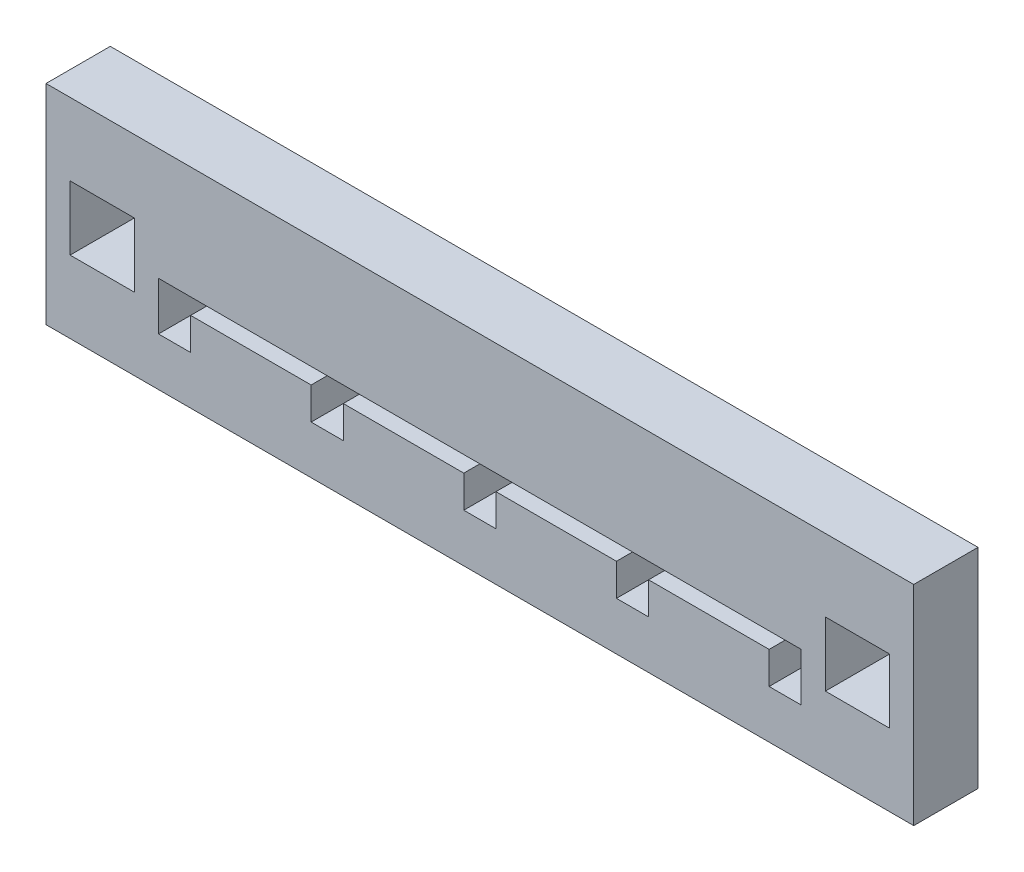
ISO-10303-21;
HEADER;
FILE_DESCRIPTION(('STEP AP214'),'2;1');
FILE_NAME('part.step','',(''),(''),'','','');
FILE_SCHEMA(('AUTOMOTIVE_DESIGN { 1 0 10303 214 1 1 1 1 }'));
ENDSEC;
DATA;
#1=APPLICATION_CONTEXT('core data for automotive mechanical design processes');
#2=APPLICATION_PROTOCOL_DEFINITION('international standard','automotive_design',2000,#1);
#3=PRODUCT_CONTEXT('',#1,'mechanical');
#4=PRODUCT('Part','Part','',(#3));
#5=PRODUCT_RELATED_PRODUCT_CATEGORY('part','',(#4));
#6=PRODUCT_DEFINITION_FORMATION('','',#4);
#7=PRODUCT_DEFINITION_CONTEXT('part definition',#1,'design');
#8=PRODUCT_DEFINITION('design','',#6,#7);
#9=PRODUCT_DEFINITION_SHAPE('','',#8);
#10=(LENGTH_UNIT() NAMED_UNIT(*) SI_UNIT(.MILLI.,.METRE.));
#11=(NAMED_UNIT(*) PLANE_ANGLE_UNIT() SI_UNIT($,.RADIAN.));
#12=(NAMED_UNIT(*) SI_UNIT($,.STERADIAN.) SOLID_ANGLE_UNIT());
#13=UNCERTAINTY_MEASURE_WITH_UNIT(LENGTH_MEASURE(1.E-05),#10,'distance_accuracy_value','');
#14=(GEOMETRIC_REPRESENTATION_CONTEXT(3) GLOBAL_UNCERTAINTY_ASSIGNED_CONTEXT((#13)) GLOBAL_UNIT_ASSIGNED_CONTEXT((#10,
#11,#12)) REPRESENTATION_CONTEXT('',''));
#15=CARTESIAN_POINT('',(0.,0.,0.));
#16=DIRECTION('',(0.,0.,1.));
#17=DIRECTION('',(1.,0.,0.));
#18=AXIS2_PLACEMENT_3D('',#15,#16,#17);
#19=CARTESIAN_POINT('',(0.,0.,4.));
#20=DIRECTION('',(0.,0.,-1.));
#21=DIRECTION('',(-1.,0.,0.));
#22=AXIS2_PLACEMENT_3D('',#19,#20,#21);
#23=PLANE('',#22);
#24=DIRECTION('',(0.,-1.,0.));
#25=VECTOR('',#24,1.);
#26=CARTESIAN_POINT('',(1.5,8.5,4.));
#27=LINE('',#26,#25);
#28=CARTESIAN_POINT('',(1.5,8.5,4.));
#29=VERTEX_POINT('',#28);
#30=CARTESIAN_POINT('',(1.5,4.5,4.));
#31=VERTEX_POINT('',#30);
#32=EDGE_CURVE('E297',#29,#31,#27,.T.);
#33=ORIENTED_EDGE('',*,*,#32,.F.);
#34=DIRECTION('',(-1.,0.,0.));
#35=VECTOR('',#34,1.);
#36=CARTESIAN_POINT('',(1.5,8.5,4.));
#37=LINE('',#36,#35);
#38=CARTESIAN_POINT('',(5.5,8.5,4.));
#39=VERTEX_POINT('',#38);
#40=EDGE_CURVE('E308',#39,#29,#37,.T.);
#41=ORIENTED_EDGE('',*,*,#40,.F.);
#42=DIRECTION('',(0.,1.,0.));
#43=VECTOR('',#42,1.);
#44=CARTESIAN_POINT('',(5.5,8.5,4.));
#45=LINE('',#44,#43);
#46=CARTESIAN_POINT('',(5.5,4.5,4.));
#47=VERTEX_POINT('',#46);
#48=EDGE_CURVE('E304',#47,#39,#45,.T.);
#49=ORIENTED_EDGE('',*,*,#48,.F.);
#50=DIRECTION('',(1.,0.,0.));
#51=VECTOR('',#50,1.);
#52=CARTESIAN_POINT('',(1.5,4.5,4.));
#53=LINE('',#52,#51);
#54=EDGE_CURVE('E300',#31,#47,#53,.T.);
#55=ORIENTED_EDGE('',*,*,#54,.F.);
#56=EDGE_LOOP('',(#33,#41,#49,#55));
#57=FACE_BOUND('',#56,.T.);
#58=DIRECTION('',(0.,-1.,0.));
#59=VECTOR('',#58,1.);
#60=CARTESIAN_POINT('',(0.,0.,4.));
#61=LINE('',#60,#59);
#62=CARTESIAN_POINT('',(0.,13.,4.));
#63=VERTEX_POINT('',#62);
#64=CARTESIAN_POINT('',(0.,0.,4.));
#65=VERTEX_POINT('',#64);
#66=EDGE_CURVE('E543',#63,#65,#61,.T.);
#67=ORIENTED_EDGE('',*,*,#66,.T.);
#68=DIRECTION('',(1.,0.,0.));
#69=VECTOR('',#68,1.);
#70=CARTESIAN_POINT('',(0.,0.,4.));
#71=LINE('',#70,#69);
#72=CARTESIAN_POINT('',(54.,0.,4.));
#73=VERTEX_POINT('',#72);
#74=EDGE_CURVE('E547',#65,#73,#71,.T.);
#75=ORIENTED_EDGE('',*,*,#74,.T.);
#76=DIRECTION('',(0.,1.,0.));
#77=VECTOR('',#76,1.);
#78=CARTESIAN_POINT('',(54.,0.,4.));
#79=LINE('',#78,#77);
#80=CARTESIAN_POINT('',(54.,13.,4.));
#81=VERTEX_POINT('',#80);
#82=EDGE_CURVE('E551',#73,#81,#79,.T.);
#83=ORIENTED_EDGE('',*,*,#82,.T.);
#84=DIRECTION('',(-1.,0.,0.));
#85=VECTOR('',#84,1.);
#86=CARTESIAN_POINT('',(0.,13.,4.));
#87=LINE('',#86,#85);
#88=EDGE_CURVE('E554',#81,#63,#87,.T.);
#89=ORIENTED_EDGE('',*,*,#88,.T.);
#90=EDGE_LOOP('',(#67,#75,#83,#89));
#91=FACE_BOUND('',#90,.T.);
#92=DIRECTION('',(1.,0.,0.));
#93=VECTOR('',#92,1.);
#94=CARTESIAN_POINT('',(7.,3.,4.));
#95=LINE('',#94,#93);
#96=CARTESIAN_POINT('',(7.,3.,4.));
#97=VERTEX_POINT('',#96);
#98=CARTESIAN_POINT('',(9.,3.,4.));
#99=VERTEX_POINT('',#98);
#100=EDGE_CURVE('E340',#97,#99,#95,.T.);
#101=ORIENTED_EDGE('',*,*,#100,.F.);
#102=DIRECTION('',(0.,-1.,0.));
#103=VECTOR('',#102,1.);
#104=CARTESIAN_POINT('',(7.,3.,4.));
#105=LINE('',#104,#103);
#106=CARTESIAN_POINT('',(7.,6.,4.));
#107=VERTEX_POINT('',#106);
#108=EDGE_CURVE('E399',#107,#97,#105,.T.);
#109=ORIENTED_EDGE('',*,*,#108,.F.);
#110=DIRECTION('',(-1.,0.,0.));
#111=VECTOR('',#110,1.);
#112=CARTESIAN_POINT('',(7.,6.,4.));
#113=LINE('',#112,#111);
#114=CARTESIAN_POINT('',(47.,6.,4.));
#115=VERTEX_POINT('',#114);
#116=EDGE_CURVE('E395',#115,#107,#113,.T.);
#117=ORIENTED_EDGE('',*,*,#116,.F.);
#118=DIRECTION('',(0.,1.,0.));
#119=VECTOR('',#118,1.);
#120=CARTESIAN_POINT('',(47.,3.,4.));
#121=LINE('',#120,#119);
#122=CARTESIAN_POINT('',(47.,3.,4.));
#123=VERTEX_POINT('',#122);
#124=EDGE_CURVE('E392',#123,#115,#121,.T.);
#125=ORIENTED_EDGE('',*,*,#124,.F.);
#126=DIRECTION('',(1.,0.,0.));
#127=VECTOR('',#126,1.);
#128=CARTESIAN_POINT('',(45.,3.,4.));
#129=LINE('',#128,#127);
#130=CARTESIAN_POINT('',(45.,3.,4.));
#131=VERTEX_POINT('',#130);
#132=EDGE_CURVE('E389',#131,#123,#129,.T.);
#133=ORIENTED_EDGE('',*,*,#132,.F.);
#134=DIRECTION('',(0.,-1.,0.));
#135=VECTOR('',#134,1.);
#136=CARTESIAN_POINT('',(45.,3.,4.));
#137=LINE('',#136,#135);
#138=CARTESIAN_POINT('',(45.,5.,4.));
#139=VERTEX_POINT('',#138);
#140=EDGE_CURVE('E386',#139,#131,#137,.T.);
#141=ORIENTED_EDGE('',*,*,#140,.F.);
#142=DIRECTION('',(1.,0.,0.));
#143=VECTOR('',#142,1.);
#144=CARTESIAN_POINT('',(37.5,5.,4.));
#145=LINE('',#144,#143);
#146=CARTESIAN_POINT('',(37.5,5.,4.));
#147=VERTEX_POINT('',#146);
#148=EDGE_CURVE('E383',#147,#139,#145,.T.);
#149=ORIENTED_EDGE('',*,*,#148,.F.);
#150=DIRECTION('',(0.,1.,0.));
#151=VECTOR('',#150,1.);
#152=CARTESIAN_POINT('',(37.5,3.,4.));
#153=LINE('',#152,#151);
#154=CARTESIAN_POINT('',(37.5,3.,4.));
#155=VERTEX_POINT('',#154);
#156=EDGE_CURVE('E380',#155,#147,#153,.T.);
#157=ORIENTED_EDGE('',*,*,#156,.F.);
#158=DIRECTION('',(1.,0.,0.));
#159=VECTOR('',#158,1.);
#160=CARTESIAN_POINT('',(35.5,3.,4.));
#161=LINE('',#160,#159);
#162=CARTESIAN_POINT('',(35.5,3.,4.));
#163=VERTEX_POINT('',#162);
#164=EDGE_CURVE('E377',#163,#155,#161,.T.);
#165=ORIENTED_EDGE('',*,*,#164,.F.);
#166=DIRECTION('',(0.,-1.,0.));
#167=VECTOR('',#166,1.);
#168=CARTESIAN_POINT('',(35.5,3.,4.));
#169=LINE('',#168,#167);
#170=CARTESIAN_POINT('',(35.5,5.,4.));
#171=VERTEX_POINT('',#170);
#172=EDGE_CURVE('E374',#171,#163,#169,.T.);
#173=ORIENTED_EDGE('',*,*,#172,.F.);
#174=DIRECTION('',(1.,0.,0.));
#175=VECTOR('',#174,1.);
#176=CARTESIAN_POINT('',(28.,5.,4.));
#177=LINE('',#176,#175);
#178=CARTESIAN_POINT('',(28.,5.,4.));
#179=VERTEX_POINT('',#178);
#180=EDGE_CURVE('E371',#179,#171,#177,.T.);
#181=ORIENTED_EDGE('',*,*,#180,.F.);
#182=DIRECTION('',(0.,1.,0.));
#183=VECTOR('',#182,1.);
#184=CARTESIAN_POINT('',(28.,3.,4.));
#185=LINE('',#184,#183);
#186=CARTESIAN_POINT('',(28.,3.,4.));
#187=VERTEX_POINT('',#186);
#188=EDGE_CURVE('E368',#187,#179,#185,.T.);
#189=ORIENTED_EDGE('',*,*,#188,.F.);
#190=DIRECTION('',(1.,0.,0.));
#191=VECTOR('',#190,1.);
#192=CARTESIAN_POINT('',(26.,3.,4.));
#193=LINE('',#192,#191);
#194=CARTESIAN_POINT('',(26.,3.,4.));
#195=VERTEX_POINT('',#194);
#196=EDGE_CURVE('E365',#195,#187,#193,.T.);
#197=ORIENTED_EDGE('',*,*,#196,.F.);
#198=DIRECTION('',(0.,-1.,0.));
#199=VECTOR('',#198,1.);
#200=CARTESIAN_POINT('',(26.,3.,4.));
#201=LINE('',#200,#199);
#202=CARTESIAN_POINT('',(26.,5.,4.));
#203=VERTEX_POINT('',#202);
#204=EDGE_CURVE('E362',#203,#195,#201,.T.);
#205=ORIENTED_EDGE('',*,*,#204,.F.);
#206=DIRECTION('',(1.,0.,0.));
#207=VECTOR('',#206,1.);
#208=CARTESIAN_POINT('',(18.5,5.,4.));
#209=LINE('',#208,#207);
#210=CARTESIAN_POINT('',(18.5,5.,4.));
#211=VERTEX_POINT('',#210);
#212=EDGE_CURVE('E359',#211,#203,#209,.T.);
#213=ORIENTED_EDGE('',*,*,#212,.F.);
#214=DIRECTION('',(0.,1.,0.));
#215=VECTOR('',#214,1.);
#216=CARTESIAN_POINT('',(18.5,3.,4.));
#217=LINE('',#216,#215);
#218=CARTESIAN_POINT('',(18.5,3.,4.));
#219=VERTEX_POINT('',#218);
#220=EDGE_CURVE('E356',#219,#211,#217,.T.);
#221=ORIENTED_EDGE('',*,*,#220,.F.);
#222=DIRECTION('',(1.,0.,0.));
#223=VECTOR('',#222,1.);
#224=CARTESIAN_POINT('',(16.5,3.,4.));
#225=LINE('',#224,#223);
#226=CARTESIAN_POINT('',(16.5,3.,4.));
#227=VERTEX_POINT('',#226);
#228=EDGE_CURVE('E353',#227,#219,#225,.T.);
#229=ORIENTED_EDGE('',*,*,#228,.F.);
#230=DIRECTION('',(0.,-1.,0.));
#231=VECTOR('',#230,1.);
#232=CARTESIAN_POINT('',(16.5,3.,4.));
#233=LINE('',#232,#231);
#234=CARTESIAN_POINT('',(16.5,5.,4.));
#235=VERTEX_POINT('',#234);
#236=EDGE_CURVE('E350',#235,#227,#233,.T.);
#237=ORIENTED_EDGE('',*,*,#236,.F.);
#238=DIRECTION('',(1.,0.,0.));
#239=VECTOR('',#238,1.);
#240=CARTESIAN_POINT('',(9.,5.,4.));
#241=LINE('',#240,#239);
#242=CARTESIAN_POINT('',(9.,5.,4.));
#243=VERTEX_POINT('',#242);
#244=EDGE_CURVE('E347',#243,#235,#241,.T.);
#245=ORIENTED_EDGE('',*,*,#244,.F.);
#246=DIRECTION('',(0.,1.,0.));
#247=VECTOR('',#246,1.);
#248=CARTESIAN_POINT('',(9.,3.,4.));
#249=LINE('',#248,#247);
#250=EDGE_CURVE('E343',#99,#243,#249,.T.);
#251=ORIENTED_EDGE('',*,*,#250,.F.);
#252=EDGE_LOOP('',(#101,#109,#117,#125,#133,#141,#149,#157,#165,#173,#181,#189,#197,#205,#213,
#221,#229,#237,#245,#251));
#253=FACE_BOUND('',#252,.T.);
#254=DIRECTION('',(0.,1.,0.));
#255=VECTOR('',#254,1.);
#256=CARTESIAN_POINT('',(52.5,8.5,4.));
#257=LINE('',#256,#255);
#258=CARTESIAN_POINT('',(52.5,4.5,4.));
#259=VERTEX_POINT('',#258);
#260=CARTESIAN_POINT('',(52.5,8.5,4.));
#261=VERTEX_POINT('',#260);
#262=EDGE_CURVE('E249',#259,#261,#257,.T.);
#263=ORIENTED_EDGE('',*,*,#262,.F.);
#264=DIRECTION('',(1.,0.,0.));
#265=VECTOR('',#264,1.);
#266=CARTESIAN_POINT('',(52.5,4.5,4.));
#267=LINE('',#266,#265);
#268=CARTESIAN_POINT('',(48.5,4.5,4.));
#269=VERTEX_POINT('',#268);
#270=EDGE_CURVE('E275',#269,#259,#267,.T.);
#271=ORIENTED_EDGE('',*,*,#270,.F.);
#272=DIRECTION('',(0.,-1.,0.));
#273=VECTOR('',#272,1.);
#274=CARTESIAN_POINT('',(48.5,8.5,4.));
#275=LINE('',#274,#273);
#276=CARTESIAN_POINT('',(48.5,8.5,4.));
#277=VERTEX_POINT('',#276);
#278=EDGE_CURVE('E271',#277,#269,#275,.T.);
#279=ORIENTED_EDGE('',*,*,#278,.F.);
#280=DIRECTION('',(-1.,0.,0.));
#281=VECTOR('',#280,1.);
#282=CARTESIAN_POINT('',(52.5,8.5,4.));
#283=LINE('',#282,#281);
#284=EDGE_CURVE('E258',#261,#277,#283,.T.);
#285=ORIENTED_EDGE('',*,*,#284,.F.);
#286=EDGE_LOOP('',(#263,#271,#279,#285));
#287=FACE_BOUND('',#286,.T.);
#288=ADVANCED_FACE('F39',(#57,#91,#253,#287),#23,.F.);
#289=CARTESIAN_POINT('',(0.,0.,0.));
#290=DIRECTION('',(0.,0.,-1.));
#291=DIRECTION('',(-1.,0.,0.));
#292=AXIS2_PLACEMENT_3D('',#289,#290,#291);
#293=PLANE('',#292);
#294=DIRECTION('',(0.,-1.,0.));
#295=VECTOR('',#294,1.);
#296=CARTESIAN_POINT('',(0.,0.,0.));
#297=LINE('',#296,#295);
#298=CARTESIAN_POINT('',(0.,13.,0.));
#299=VERTEX_POINT('',#298);
#300=CARTESIAN_POINT('',(0.,0.,0.));
#301=VERTEX_POINT('',#300);
#302=EDGE_CURVE('E542',#299,#301,#297,.T.);
#303=ORIENTED_EDGE('',*,*,#302,.F.);
#304=DIRECTION('',(-1.,0.,0.));
#305=VECTOR('',#304,1.);
#306=CARTESIAN_POINT('',(0.,13.,0.));
#307=LINE('',#306,#305);
#308=CARTESIAN_POINT('',(54.,13.,0.));
#309=VERTEX_POINT('',#308);
#310=EDGE_CURVE('E548',#309,#299,#307,.T.);
#311=ORIENTED_EDGE('',*,*,#310,.F.);
#312=DIRECTION('',(0.,1.,0.));
#313=VECTOR('',#312,1.);
#314=CARTESIAN_POINT('',(54.,0.,0.));
#315=LINE('',#314,#313);
#316=CARTESIAN_POINT('',(54.,0.,0.));
#317=VERTEX_POINT('',#316);
#318=EDGE_CURVE('E564',#317,#309,#315,.T.);
#319=ORIENTED_EDGE('',*,*,#318,.F.);
#320=DIRECTION('',(1.,0.,0.));
#321=VECTOR('',#320,1.);
#322=CARTESIAN_POINT('',(0.,0.,0.));
#323=LINE('',#322,#321);
#324=EDGE_CURVE('E561',#301,#317,#323,.T.);
#325=ORIENTED_EDGE('',*,*,#324,.F.);
#326=EDGE_LOOP('',(#303,#311,#319,#325));
#327=FACE_BOUND('',#326,.T.);
#328=DIRECTION('',(0.,-1.,0.));
#329=VECTOR('',#328,1.);
#330=CARTESIAN_POINT('',(7.,3.,0.));
#331=LINE('',#330,#329);
#332=CARTESIAN_POINT('',(7.,6.,0.));
#333=VERTEX_POINT('',#332);
#334=CARTESIAN_POINT('',(7.,3.,0.));
#335=VERTEX_POINT('',#334);
#336=EDGE_CURVE('E344',#333,#335,#331,.T.);
#337=ORIENTED_EDGE('',*,*,#336,.T.);
#338=DIRECTION('',(1.,0.,0.));
#339=VECTOR('',#338,1.);
#340=CARTESIAN_POINT('',(7.,3.,0.));
#341=LINE('',#340,#339);
#342=CARTESIAN_POINT('',(9.,3.,0.));
#343=VERTEX_POINT('',#342);
#344=EDGE_CURVE('E339',#335,#343,#341,.T.);
#345=ORIENTED_EDGE('',*,*,#344,.T.);
#346=DIRECTION('',(0.,1.,0.));
#347=VECTOR('',#346,1.);
#348=CARTESIAN_POINT('',(9.,3.,0.));
#349=LINE('',#348,#347);
#350=CARTESIAN_POINT('',(9.,5.,0.));
#351=VERTEX_POINT('',#350);
#352=EDGE_CURVE('E406',#343,#351,#349,.T.);
#353=ORIENTED_EDGE('',*,*,#352,.T.);
#354=DIRECTION('',(1.,0.,0.));
#355=VECTOR('',#354,1.);
#356=CARTESIAN_POINT('',(9.,5.,0.));
#357=LINE('',#356,#355);
#358=CARTESIAN_POINT('',(16.5,5.,0.));
#359=VERTEX_POINT('',#358);
#360=EDGE_CURVE('E410',#351,#359,#357,.T.);
#361=ORIENTED_EDGE('',*,*,#360,.T.);
#362=DIRECTION('',(0.,-1.,0.));
#363=VECTOR('',#362,1.);
#364=CARTESIAN_POINT('',(16.5,3.,0.));
#365=LINE('',#364,#363);
#366=CARTESIAN_POINT('',(16.5,3.,0.));
#367=VERTEX_POINT('',#366);
#368=EDGE_CURVE('E414',#359,#367,#365,.T.);
#369=ORIENTED_EDGE('',*,*,#368,.T.);
#370=DIRECTION('',(1.,0.,0.));
#371=VECTOR('',#370,1.);
#372=CARTESIAN_POINT('',(16.5,3.,0.));
#373=LINE('',#372,#371);
#374=CARTESIAN_POINT('',(18.5,3.,0.));
#375=VERTEX_POINT('',#374);
#376=EDGE_CURVE('E418',#367,#375,#373,.T.);
#377=ORIENTED_EDGE('',*,*,#376,.T.);
#378=DIRECTION('',(0.,1.,0.));
#379=VECTOR('',#378,1.);
#380=CARTESIAN_POINT('',(18.5,3.,0.));
#381=LINE('',#380,#379);
#382=CARTESIAN_POINT('',(18.5,5.,0.));
#383=VERTEX_POINT('',#382);
#384=EDGE_CURVE('E422',#375,#383,#381,.T.);
#385=ORIENTED_EDGE('',*,*,#384,.T.);
#386=DIRECTION('',(1.,0.,0.));
#387=VECTOR('',#386,1.);
#388=CARTESIAN_POINT('',(18.5,5.,0.));
#389=LINE('',#388,#387);
#390=CARTESIAN_POINT('',(26.,5.,0.));
#391=VERTEX_POINT('',#390);
#392=EDGE_CURVE('E426',#383,#391,#389,.T.);
#393=ORIENTED_EDGE('',*,*,#392,.T.);
#394=DIRECTION('',(0.,-1.,0.));
#395=VECTOR('',#394,1.);
#396=CARTESIAN_POINT('',(26.,3.,0.));
#397=LINE('',#396,#395);
#398=CARTESIAN_POINT('',(26.,3.,0.));
#399=VERTEX_POINT('',#398);
#400=EDGE_CURVE('E430',#391,#399,#397,.T.);
#401=ORIENTED_EDGE('',*,*,#400,.T.);
#402=DIRECTION('',(1.,0.,0.));
#403=VECTOR('',#402,1.);
#404=CARTESIAN_POINT('',(26.,3.,0.));
#405=LINE('',#404,#403);
#406=CARTESIAN_POINT('',(28.,3.,0.));
#407=VERTEX_POINT('',#406);
#408=EDGE_CURVE('E434',#399,#407,#405,.T.);
#409=ORIENTED_EDGE('',*,*,#408,.T.);
#410=DIRECTION('',(0.,1.,0.));
#411=VECTOR('',#410,1.);
#412=CARTESIAN_POINT('',(28.,3.,0.));
#413=LINE('',#412,#411);
#414=CARTESIAN_POINT('',(28.,5.,0.));
#415=VERTEX_POINT('',#414);
#416=EDGE_CURVE('E438',#407,#415,#413,.T.);
#417=ORIENTED_EDGE('',*,*,#416,.T.);
#418=DIRECTION('',(1.,0.,0.));
#419=VECTOR('',#418,1.);
#420=CARTESIAN_POINT('',(28.,5.,0.));
#421=LINE('',#420,#419);
#422=CARTESIAN_POINT('',(35.5,5.,0.));
#423=VERTEX_POINT('',#422);
#424=EDGE_CURVE('E442',#415,#423,#421,.T.);
#425=ORIENTED_EDGE('',*,*,#424,.T.);
#426=DIRECTION('',(0.,-1.,0.));
#427=VECTOR('',#426,1.);
#428=CARTESIAN_POINT('',(35.5,3.,0.));
#429=LINE('',#428,#427);
#430=CARTESIAN_POINT('',(35.5,3.,0.));
#431=VERTEX_POINT('',#430);
#432=EDGE_CURVE('E446',#423,#431,#429,.T.);
#433=ORIENTED_EDGE('',*,*,#432,.T.);
#434=DIRECTION('',(1.,0.,0.));
#435=VECTOR('',#434,1.);
#436=CARTESIAN_POINT('',(35.5,3.,0.));
#437=LINE('',#436,#435);
#438=CARTESIAN_POINT('',(37.5,3.,0.));
#439=VERTEX_POINT('',#438);
#440=EDGE_CURVE('E450',#431,#439,#437,.T.);
#441=ORIENTED_EDGE('',*,*,#440,.T.);
#442=DIRECTION('',(0.,1.,0.));
#443=VECTOR('',#442,1.);
#444=CARTESIAN_POINT('',(37.5,3.,0.));
#445=LINE('',#444,#443);
#446=CARTESIAN_POINT('',(37.5,5.,0.));
#447=VERTEX_POINT('',#446);
#448=EDGE_CURVE('E454',#439,#447,#445,.T.);
#449=ORIENTED_EDGE('',*,*,#448,.T.);
#450=DIRECTION('',(1.,0.,0.));
#451=VECTOR('',#450,1.);
#452=CARTESIAN_POINT('',(37.5,5.,0.));
#453=LINE('',#452,#451);
#454=CARTESIAN_POINT('',(45.,5.,0.));
#455=VERTEX_POINT('',#454);
#456=EDGE_CURVE('E458',#447,#455,#453,.T.);
#457=ORIENTED_EDGE('',*,*,#456,.T.);
#458=DIRECTION('',(0.,-1.,0.));
#459=VECTOR('',#458,1.);
#460=CARTESIAN_POINT('',(45.,3.,0.));
#461=LINE('',#460,#459);
#462=CARTESIAN_POINT('',(45.,3.,0.));
#463=VERTEX_POINT('',#462);
#464=EDGE_CURVE('E462',#455,#463,#461,.T.);
#465=ORIENTED_EDGE('',*,*,#464,.T.);
#466=DIRECTION('',(1.,0.,0.));
#467=VECTOR('',#466,1.);
#468=CARTESIAN_POINT('',(45.,3.,0.));
#469=LINE('',#468,#467);
#470=CARTESIAN_POINT('',(47.,3.,0.));
#471=VERTEX_POINT('',#470);
#472=EDGE_CURVE('E466',#463,#471,#469,.T.);
#473=ORIENTED_EDGE('',*,*,#472,.T.);
#474=DIRECTION('',(0.,1.,0.));
#475=VECTOR('',#474,1.);
#476=CARTESIAN_POINT('',(47.,3.,0.));
#477=LINE('',#476,#475);
#478=CARTESIAN_POINT('',(47.,6.,0.));
#479=VERTEX_POINT('',#478);
#480=EDGE_CURVE('E470',#471,#479,#477,.T.);
#481=ORIENTED_EDGE('',*,*,#480,.T.);
#482=DIRECTION('',(-1.,0.,0.));
#483=VECTOR('',#482,1.);
#484=CARTESIAN_POINT('',(7.,6.,0.));
#485=LINE('',#484,#483);
#486=EDGE_CURVE('E474',#479,#333,#485,.T.);
#487=ORIENTED_EDGE('',*,*,#486,.T.);
#488=EDGE_LOOP('',(#337,#345,#353,#361,#369,#377,#385,#393,#401,#409,#417,#425,#433,#441,#449,
#457,#465,#473,#481,#487));
#489=FACE_BOUND('',#488,.T.);
#490=DIRECTION('',(-1.,0.,0.));
#491=VECTOR('',#490,1.);
#492=CARTESIAN_POINT('',(1.5,8.5,0.));
#493=LINE('',#492,#491);
#494=CARTESIAN_POINT('',(5.5,8.5,0.));
#495=VERTEX_POINT('',#494);
#496=CARTESIAN_POINT('',(1.5,8.5,0.));
#497=VERTEX_POINT('',#496);
#498=EDGE_CURVE('E301',#495,#497,#493,.T.);
#499=ORIENTED_EDGE('',*,*,#498,.T.);
#500=DIRECTION('',(0.,-1.,0.));
#501=VECTOR('',#500,1.);
#502=CARTESIAN_POINT('',(1.5,8.5,0.));
#503=LINE('',#502,#501);
#504=CARTESIAN_POINT('',(1.5,4.5,0.));
#505=VERTEX_POINT('',#504);
#506=EDGE_CURVE('E267',#497,#505,#503,.T.);
#507=ORIENTED_EDGE('',*,*,#506,.T.);
#508=DIRECTION('',(1.,0.,0.));
#509=VECTOR('',#508,1.);
#510=CARTESIAN_POINT('',(1.5,4.5,0.));
#511=LINE('',#510,#509);
#512=CARTESIAN_POINT('',(5.5,4.5,0.));
#513=VERTEX_POINT('',#512);
#514=EDGE_CURVE('E315',#505,#513,#511,.T.);
#515=ORIENTED_EDGE('',*,*,#514,.T.);
#516=DIRECTION('',(0.,1.,0.));
#517=VECTOR('',#516,1.);
#518=CARTESIAN_POINT('',(5.5,8.5,0.));
#519=LINE('',#518,#517);
#520=EDGE_CURVE('E319',#513,#495,#519,.T.);
#521=ORIENTED_EDGE('',*,*,#520,.T.);
#522=EDGE_LOOP('',(#499,#507,#515,#521));
#523=FACE_BOUND('',#522,.T.);
#524=DIRECTION('',(1.,0.,0.));
#525=VECTOR('',#524,1.);
#526=CARTESIAN_POINT('',(52.5,4.5,0.));
#527=LINE('',#526,#525);
#528=CARTESIAN_POINT('',(48.5,4.5,0.));
#529=VERTEX_POINT('',#528);
#530=CARTESIAN_POINT('',(52.5,4.5,0.));
#531=VERTEX_POINT('',#530);
#532=EDGE_CURVE('E259',#529,#531,#527,.T.);
#533=ORIENTED_EDGE('',*,*,#532,.T.);
#534=DIRECTION('',(0.,1.,0.));
#535=VECTOR('',#534,1.);
#536=CARTESIAN_POINT('',(52.5,8.5,0.));
#537=LINE('',#536,#535);
#538=CARTESIAN_POINT('',(52.5,8.5,0.));
#539=VERTEX_POINT('',#538);
#540=EDGE_CURVE('E63',#531,#539,#537,.T.);
#541=ORIENTED_EDGE('',*,*,#540,.T.);
#542=DIRECTION('',(-1.,0.,0.));
#543=VECTOR('',#542,1.);
#544=CARTESIAN_POINT('',(52.5,8.5,0.));
#545=LINE('',#544,#543);
#546=CARTESIAN_POINT('',(48.5,8.5,0.));
#547=VERTEX_POINT('',#546);
#548=EDGE_CURVE('E265',#539,#547,#545,.T.);
#549=ORIENTED_EDGE('',*,*,#548,.T.);
#550=DIRECTION('',(0.,-1.,0.));
#551=VECTOR('',#550,1.);
#552=CARTESIAN_POINT('',(48.5,8.5,0.));
#553=LINE('',#552,#551);
#554=EDGE_CURVE('E284',#547,#529,#553,.T.);
#555=ORIENTED_EDGE('',*,*,#554,.T.);
#556=EDGE_LOOP('',(#533,#541,#549,#555));
#557=FACE_BOUND('',#556,.T.);
#558=ADVANCED_FACE('F587',(#327,#489,#523,#557),#293,.T.);
#559=CARTESIAN_POINT('',(0.,0.,4.));
#560=DIRECTION('',(1.,0.,0.));
#561=DIRECTION('',(0.,0.,-1.));
#562=AXIS2_PLACEMENT_3D('',#559,#560,#561);
#563=PLANE('',#562);
#564=ORIENTED_EDGE('',*,*,#302,.T.);
#565=DIRECTION('',(0.,0.,-1.));
#566=VECTOR('',#565,1.);
#567=CARTESIAN_POINT('',(0.,0.,4.));
#568=LINE('',#567,#566);
#569=EDGE_CURVE('E11',#65,#301,#568,.T.);
#570=ORIENTED_EDGE('',*,*,#569,.F.);
#571=ORIENTED_EDGE('',*,*,#66,.F.);
#572=DIRECTION('',(0.,0.,-1.));
#573=VECTOR('',#572,1.);
#574=CARTESIAN_POINT('',(0.,13.,4.));
#575=LINE('',#574,#573);
#576=EDGE_CURVE('E557',#63,#299,#575,.T.);
#577=ORIENTED_EDGE('',*,*,#576,.T.);
#578=EDGE_LOOP('',(#564,#570,#571,#577));
#579=FACE_BOUND('',#578,.T.);
#580=ADVANCED_FACE('F41',(#579),#563,.F.);
#581=CARTESIAN_POINT('',(0.,0.,4.));
#582=DIRECTION('',(0.,1.,0.));
#583=DIRECTION('',(0.,0.,1.));
#584=AXIS2_PLACEMENT_3D('',#581,#582,#583);
#585=PLANE('',#584);
#586=ORIENTED_EDGE('',*,*,#324,.T.);
#587=DIRECTION('',(0.,0.,-1.));
#588=VECTOR('',#587,1.);
#589=CARTESIAN_POINT('',(54.,0.,4.));
#590=LINE('',#589,#588);
#591=EDGE_CURVE('E48',#73,#317,#590,.T.);
#592=ORIENTED_EDGE('',*,*,#591,.F.);
#593=ORIENTED_EDGE('',*,*,#74,.F.);
#594=ORIENTED_EDGE('',*,*,#569,.T.);
#595=EDGE_LOOP('',(#586,#592,#593,#594));
#596=FACE_BOUND('',#595,.T.);
#597=ADVANCED_FACE('F598',(#596),#585,.F.);
#598=CARTESIAN_POINT('',(54.,0.,4.));
#599=DIRECTION('',(-1.,0.,0.));
#600=DIRECTION('',(0.,0.,1.));
#601=AXIS2_PLACEMENT_3D('',#598,#599,#600);
#602=PLANE('',#601);
#603=ORIENTED_EDGE('',*,*,#318,.T.);
#604=DIRECTION('',(0.,0.,-1.));
#605=VECTOR('',#604,1.);
#606=CARTESIAN_POINT('',(54.,13.,4.));
#607=LINE('',#606,#605);
#608=EDGE_CURVE('E572',#81,#309,#607,.T.);
#609=ORIENTED_EDGE('',*,*,#608,.F.);
#610=ORIENTED_EDGE('',*,*,#82,.F.);
#611=ORIENTED_EDGE('',*,*,#591,.T.);
#612=EDGE_LOOP('',(#603,#609,#610,#611));
#613=FACE_BOUND('',#612,.T.);
#614=ADVANCED_FACE('F581',(#613),#602,.F.);
#615=CARTESIAN_POINT('',(0.,13.,4.));
#616=DIRECTION('',(0.,-1.,0.));
#617=DIRECTION('',(0.,0.,-1.));
#618=AXIS2_PLACEMENT_3D('',#615,#616,#617);
#619=PLANE('',#618);
#620=ORIENTED_EDGE('',*,*,#310,.T.);
#621=ORIENTED_EDGE('',*,*,#576,.F.);
#622=ORIENTED_EDGE('',*,*,#88,.F.);
#623=ORIENTED_EDGE('',*,*,#608,.T.);
#624=EDGE_LOOP('',(#620,#621,#622,#623));
#625=FACE_BOUND('',#624,.T.);
#626=ADVANCED_FACE('F591',(#625),#619,.F.);
#627=CARTESIAN_POINT('',(7.,3.,4.));
#628=DIRECTION('',(0.,1.,0.));
#629=DIRECTION('',(0.,0.,1.));
#630=AXIS2_PLACEMENT_3D('',#627,#628,#629);
#631=PLANE('',#630);
#632=ORIENTED_EDGE('',*,*,#344,.F.);
#633=DIRECTION('',(0.,0.,-1.));
#634=VECTOR('',#633,1.);
#635=CARTESIAN_POINT('',(7.,3.,4.));
#636=LINE('',#635,#634);
#637=EDGE_CURVE('E402',#97,#335,#636,.T.);
#638=ORIENTED_EDGE('',*,*,#637,.F.);
#639=ORIENTED_EDGE('',*,*,#100,.T.);
#640=DIRECTION('',(0.,0.,-1.));
#641=VECTOR('',#640,1.);
#642=CARTESIAN_POINT('',(9.,3.,4.));
#643=LINE('',#642,#641);
#644=EDGE_CURVE('E538',#99,#343,#643,.T.);
#645=ORIENTED_EDGE('',*,*,#644,.T.);
#646=EDGE_LOOP('',(#632,#638,#639,#645));
#647=FACE_BOUND('',#646,.T.);
#648=ADVANCED_FACE('F614',(#647),#631,.T.);
#649=CARTESIAN_POINT('',(9.,3.,4.));
#650=DIRECTION('',(-1.,0.,0.));
#651=DIRECTION('',(0.,0.,1.));
#652=AXIS2_PLACEMENT_3D('',#649,#650,#651);
#653=PLANE('',#652);
#654=ORIENTED_EDGE('',*,*,#352,.F.);
#655=ORIENTED_EDGE('',*,*,#644,.F.);
#656=ORIENTED_EDGE('',*,*,#250,.T.);
#657=DIRECTION('',(0.,0.,-1.));
#658=VECTOR('',#657,1.);
#659=CARTESIAN_POINT('',(9.,5.,4.));
#660=LINE('',#659,#658);
#661=EDGE_CURVE('E535',#243,#351,#660,.T.);
#662=ORIENTED_EDGE('',*,*,#661,.T.);
#663=EDGE_LOOP('',(#654,#655,#656,#662));
#664=FACE_BOUND('',#663,.T.);
#665=ADVANCED_FACE('F621',(#664),#653,.T.);
#666=CARTESIAN_POINT('',(9.,5.,4.));
#667=DIRECTION('',(0.,1.,0.));
#668=DIRECTION('',(0.,0.,1.));
#669=AXIS2_PLACEMENT_3D('',#666,#667,#668);
#670=PLANE('',#669);
#671=ORIENTED_EDGE('',*,*,#360,.F.);
#672=ORIENTED_EDGE('',*,*,#661,.F.);
#673=ORIENTED_EDGE('',*,*,#244,.T.);
#674=DIRECTION('',(0.,0.,-1.));
#675=VECTOR('',#674,1.);
#676=CARTESIAN_POINT('',(16.5,5.,4.));
#677=LINE('',#676,#675);
#678=EDGE_CURVE('E532',#235,#359,#677,.T.);
#679=ORIENTED_EDGE('',*,*,#678,.T.);
#680=EDGE_LOOP('',(#671,#672,#673,#679));
#681=FACE_BOUND('',#680,.T.);
#682=ADVANCED_FACE('F626',(#681),#670,.T.);
#683=CARTESIAN_POINT('',(16.5,3.,4.));
#684=DIRECTION('',(1.,0.,0.));
#685=DIRECTION('',(0.,0.,-1.));
#686=AXIS2_PLACEMENT_3D('',#683,#684,#685);
#687=PLANE('',#686);
#688=ORIENTED_EDGE('',*,*,#368,.F.);
#689=ORIENTED_EDGE('',*,*,#678,.F.);
#690=ORIENTED_EDGE('',*,*,#236,.T.);
#691=DIRECTION('',(0.,0.,-1.));
#692=VECTOR('',#691,1.);
#693=CARTESIAN_POINT('',(16.5,3.,4.));
#694=LINE('',#693,#692);
#695=EDGE_CURVE('E529',#227,#367,#694,.T.);
#696=ORIENTED_EDGE('',*,*,#695,.T.);
#697=EDGE_LOOP('',(#688,#689,#690,#696));
#698=FACE_BOUND('',#697,.T.);
#699=ADVANCED_FACE('F652',(#698),#687,.T.);
#700=CARTESIAN_POINT('',(16.5,3.,4.));
#701=DIRECTION('',(0.,1.,0.));
#702=DIRECTION('',(0.,0.,1.));
#703=AXIS2_PLACEMENT_3D('',#700,#701,#702);
#704=PLANE('',#703);
#705=ORIENTED_EDGE('',*,*,#376,.F.);
#706=ORIENTED_EDGE('',*,*,#695,.F.);
#707=ORIENTED_EDGE('',*,*,#228,.T.);
#708=DIRECTION('',(0.,0.,-1.));
#709=VECTOR('',#708,1.);
#710=CARTESIAN_POINT('',(18.5,3.,4.));
#711=LINE('',#710,#709);
#712=EDGE_CURVE('E526',#219,#375,#711,.T.);
#713=ORIENTED_EDGE('',*,*,#712,.T.);
#714=EDGE_LOOP('',(#705,#706,#707,#713));
#715=FACE_BOUND('',#714,.T.);
#716=ADVANCED_FACE('F657',(#715),#704,.T.);
#717=CARTESIAN_POINT('',(18.5,3.,4.));
#718=DIRECTION('',(-1.,0.,0.));
#719=DIRECTION('',(0.,0.,1.));
#720=AXIS2_PLACEMENT_3D('',#717,#718,#719);
#721=PLANE('',#720);
#722=ORIENTED_EDGE('',*,*,#384,.F.);
#723=ORIENTED_EDGE('',*,*,#712,.F.);
#724=ORIENTED_EDGE('',*,*,#220,.T.);
#725=DIRECTION('',(0.,0.,-1.));
#726=VECTOR('',#725,1.);
#727=CARTESIAN_POINT('',(18.5,5.,4.));
#728=LINE('',#727,#726);
#729=EDGE_CURVE('E523',#211,#383,#728,.T.);
#730=ORIENTED_EDGE('',*,*,#729,.T.);
#731=EDGE_LOOP('',(#722,#723,#724,#730));
#732=FACE_BOUND('',#731,.T.);
#733=ADVANCED_FACE('F662',(#732),#721,.T.);
#734=CARTESIAN_POINT('',(18.5,5.,4.));
#735=DIRECTION('',(0.,1.,0.));
#736=DIRECTION('',(0.,0.,1.));
#737=AXIS2_PLACEMENT_3D('',#734,#735,#736);
#738=PLANE('',#737);
#739=ORIENTED_EDGE('',*,*,#392,.F.);
#740=ORIENTED_EDGE('',*,*,#729,.F.);
#741=ORIENTED_EDGE('',*,*,#212,.T.);
#742=DIRECTION('',(0.,0.,-1.));
#743=VECTOR('',#742,1.);
#744=CARTESIAN_POINT('',(26.,5.,4.));
#745=LINE('',#744,#743);
#746=EDGE_CURVE('E520',#203,#391,#745,.T.);
#747=ORIENTED_EDGE('',*,*,#746,.T.);
#748=EDGE_LOOP('',(#739,#740,#741,#747));
#749=FACE_BOUND('',#748,.T.);
#750=ADVANCED_FACE('F667',(#749),#738,.T.);
#751=CARTESIAN_POINT('',(26.,3.,4.));
#752=DIRECTION('',(1.,0.,0.));
#753=DIRECTION('',(0.,0.,-1.));
#754=AXIS2_PLACEMENT_3D('',#751,#752,#753);
#755=PLANE('',#754);
#756=ORIENTED_EDGE('',*,*,#400,.F.);
#757=ORIENTED_EDGE('',*,*,#746,.F.);
#758=ORIENTED_EDGE('',*,*,#204,.T.);
#759=DIRECTION('',(0.,0.,-1.));
#760=VECTOR('',#759,1.);
#761=CARTESIAN_POINT('',(26.,3.,4.));
#762=LINE('',#761,#760);
#763=EDGE_CURVE('E517',#195,#399,#762,.T.);
#764=ORIENTED_EDGE('',*,*,#763,.T.);
#765=EDGE_LOOP('',(#756,#757,#758,#764));
#766=FACE_BOUND('',#765,.T.);
#767=ADVANCED_FACE('F672',(#766),#755,.T.);
#768=CARTESIAN_POINT('',(26.,3.,4.));
#769=DIRECTION('',(0.,1.,0.));
#770=DIRECTION('',(0.,0.,1.));
#771=AXIS2_PLACEMENT_3D('',#768,#769,#770);
#772=PLANE('',#771);
#773=ORIENTED_EDGE('',*,*,#408,.F.);
#774=ORIENTED_EDGE('',*,*,#763,.F.);
#775=ORIENTED_EDGE('',*,*,#196,.T.);
#776=DIRECTION('',(0.,0.,-1.));
#777=VECTOR('',#776,1.);
#778=CARTESIAN_POINT('',(28.,3.,4.));
#779=LINE('',#778,#777);
#780=EDGE_CURVE('E514',#187,#407,#779,.T.);
#781=ORIENTED_EDGE('',*,*,#780,.T.);
#782=EDGE_LOOP('',(#773,#774,#775,#781));
#783=FACE_BOUND('',#782,.T.);
#784=ADVANCED_FACE('F677',(#783),#772,.T.);
#785=CARTESIAN_POINT('',(28.,3.,4.));
#786=DIRECTION('',(-1.,0.,0.));
#787=DIRECTION('',(0.,0.,1.));
#788=AXIS2_PLACEMENT_3D('',#785,#786,#787);
#789=PLANE('',#788);
#790=ORIENTED_EDGE('',*,*,#416,.F.);
#791=ORIENTED_EDGE('',*,*,#780,.F.);
#792=ORIENTED_EDGE('',*,*,#188,.T.);
#793=DIRECTION('',(0.,0.,-1.));
#794=VECTOR('',#793,1.);
#795=CARTESIAN_POINT('',(28.,5.,4.));
#796=LINE('',#795,#794);
#797=EDGE_CURVE('E511',#179,#415,#796,.T.);
#798=ORIENTED_EDGE('',*,*,#797,.T.);
#799=EDGE_LOOP('',(#790,#791,#792,#798));
#800=FACE_BOUND('',#799,.T.);
#801=ADVANCED_FACE('F682',(#800),#789,.T.);
#802=CARTESIAN_POINT('',(28.,5.,4.));
#803=DIRECTION('',(0.,1.,0.));
#804=DIRECTION('',(0.,0.,1.));
#805=AXIS2_PLACEMENT_3D('',#802,#803,#804);
#806=PLANE('',#805);
#807=ORIENTED_EDGE('',*,*,#424,.F.);
#808=ORIENTED_EDGE('',*,*,#797,.F.);
#809=ORIENTED_EDGE('',*,*,#180,.T.);
#810=DIRECTION('',(0.,0.,-1.));
#811=VECTOR('',#810,1.);
#812=CARTESIAN_POINT('',(35.5,5.,4.));
#813=LINE('',#812,#811);
#814=EDGE_CURVE('E508',#171,#423,#813,.T.);
#815=ORIENTED_EDGE('',*,*,#814,.T.);
#816=EDGE_LOOP('',(#807,#808,#809,#815));
#817=FACE_BOUND('',#816,.T.);
#818=ADVANCED_FACE('F687',(#817),#806,.T.);
#819=CARTESIAN_POINT('',(35.5,3.,4.));
#820=DIRECTION('',(1.,0.,0.));
#821=DIRECTION('',(0.,0.,-1.));
#822=AXIS2_PLACEMENT_3D('',#819,#820,#821);
#823=PLANE('',#822);
#824=ORIENTED_EDGE('',*,*,#432,.F.);
#825=ORIENTED_EDGE('',*,*,#814,.F.);
#826=ORIENTED_EDGE('',*,*,#172,.T.);
#827=DIRECTION('',(0.,0.,-1.));
#828=VECTOR('',#827,1.);
#829=CARTESIAN_POINT('',(35.5,3.,4.));
#830=LINE('',#829,#828);
#831=EDGE_CURVE('E505',#163,#431,#830,.T.);
#832=ORIENTED_EDGE('',*,*,#831,.T.);
#833=EDGE_LOOP('',(#824,#825,#826,#832));
#834=FACE_BOUND('',#833,.T.);
#835=ADVANCED_FACE('F692',(#834),#823,.T.);
#836=CARTESIAN_POINT('',(35.5,3.,4.));
#837=DIRECTION('',(0.,1.,0.));
#838=DIRECTION('',(0.,0.,1.));
#839=AXIS2_PLACEMENT_3D('',#836,#837,#838);
#840=PLANE('',#839);
#841=ORIENTED_EDGE('',*,*,#440,.F.);
#842=ORIENTED_EDGE('',*,*,#831,.F.);
#843=ORIENTED_EDGE('',*,*,#164,.T.);
#844=DIRECTION('',(0.,0.,-1.));
#845=VECTOR('',#844,1.);
#846=CARTESIAN_POINT('',(37.5,3.,4.));
#847=LINE('',#846,#845);
#848=EDGE_CURVE('E502',#155,#439,#847,.T.);
#849=ORIENTED_EDGE('',*,*,#848,.T.);
#850=EDGE_LOOP('',(#841,#842,#843,#849));
#851=FACE_BOUND('',#850,.T.);
#852=ADVANCED_FACE('F697',(#851),#840,.T.);
#853=CARTESIAN_POINT('',(37.5,3.,4.));
#854=DIRECTION('',(-1.,0.,0.));
#855=DIRECTION('',(0.,0.,1.));
#856=AXIS2_PLACEMENT_3D('',#853,#854,#855);
#857=PLANE('',#856);
#858=ORIENTED_EDGE('',*,*,#448,.F.);
#859=ORIENTED_EDGE('',*,*,#848,.F.);
#860=ORIENTED_EDGE('',*,*,#156,.T.);
#861=DIRECTION('',(0.,0.,-1.));
#862=VECTOR('',#861,1.);
#863=CARTESIAN_POINT('',(37.5,5.,4.));
#864=LINE('',#863,#862);
#865=EDGE_CURVE('E499',#147,#447,#864,.T.);
#866=ORIENTED_EDGE('',*,*,#865,.T.);
#867=EDGE_LOOP('',(#858,#859,#860,#866));
#868=FACE_BOUND('',#867,.T.);
#869=ADVANCED_FACE('F702',(#868),#857,.T.);
#870=CARTESIAN_POINT('',(37.5,5.,4.));
#871=DIRECTION('',(0.,1.,0.));
#872=DIRECTION('',(0.,0.,1.));
#873=AXIS2_PLACEMENT_3D('',#870,#871,#872);
#874=PLANE('',#873);
#875=ORIENTED_EDGE('',*,*,#456,.F.);
#876=ORIENTED_EDGE('',*,*,#865,.F.);
#877=ORIENTED_EDGE('',*,*,#148,.T.);
#878=DIRECTION('',(0.,0.,-1.));
#879=VECTOR('',#878,1.);
#880=CARTESIAN_POINT('',(45.,5.,4.));
#881=LINE('',#880,#879);
#882=EDGE_CURVE('E496',#139,#455,#881,.T.);
#883=ORIENTED_EDGE('',*,*,#882,.T.);
#884=EDGE_LOOP('',(#875,#876,#877,#883));
#885=FACE_BOUND('',#884,.T.);
#886=ADVANCED_FACE('F707',(#885),#874,.T.);
#887=CARTESIAN_POINT('',(45.,3.,4.));
#888=DIRECTION('',(1.,0.,0.));
#889=DIRECTION('',(0.,0.,-1.));
#890=AXIS2_PLACEMENT_3D('',#887,#888,#889);
#891=PLANE('',#890);
#892=ORIENTED_EDGE('',*,*,#464,.F.);
#893=ORIENTED_EDGE('',*,*,#882,.F.);
#894=ORIENTED_EDGE('',*,*,#140,.T.);
#895=DIRECTION('',(0.,0.,-1.));
#896=VECTOR('',#895,1.);
#897=CARTESIAN_POINT('',(45.,3.,4.));
#898=LINE('',#897,#896);
#899=EDGE_CURVE('E493',#131,#463,#898,.T.);
#900=ORIENTED_EDGE('',*,*,#899,.T.);
#901=EDGE_LOOP('',(#892,#893,#894,#900));
#902=FACE_BOUND('',#901,.T.);
#903=ADVANCED_FACE('F712',(#902),#891,.T.);
#904=CARTESIAN_POINT('',(45.,3.,4.));
#905=DIRECTION('',(0.,1.,0.));
#906=DIRECTION('',(0.,0.,1.));
#907=AXIS2_PLACEMENT_3D('',#904,#905,#906);
#908=PLANE('',#907);
#909=ORIENTED_EDGE('',*,*,#472,.F.);
#910=ORIENTED_EDGE('',*,*,#899,.F.);
#911=ORIENTED_EDGE('',*,*,#132,.T.);
#912=DIRECTION('',(0.,0.,-1.));
#913=VECTOR('',#912,1.);
#914=CARTESIAN_POINT('',(47.,3.,4.));
#915=LINE('',#914,#913);
#916=EDGE_CURVE('E490',#123,#471,#915,.T.);
#917=ORIENTED_EDGE('',*,*,#916,.T.);
#918=EDGE_LOOP('',(#909,#910,#911,#917));
#919=FACE_BOUND('',#918,.T.);
#920=ADVANCED_FACE('F717',(#919),#908,.T.);
#921=CARTESIAN_POINT('',(47.,3.,4.));
#922=DIRECTION('',(-1.,0.,0.));
#923=DIRECTION('',(0.,0.,1.));
#924=AXIS2_PLACEMENT_3D('',#921,#922,#923);
#925=PLANE('',#924);
#926=ORIENTED_EDGE('',*,*,#480,.F.);
#927=ORIENTED_EDGE('',*,*,#916,.F.);
#928=ORIENTED_EDGE('',*,*,#124,.T.);
#929=DIRECTION('',(0.,0.,-1.));
#930=VECTOR('',#929,1.);
#931=CARTESIAN_POINT('',(47.,6.,4.));
#932=LINE('',#931,#930);
#933=EDGE_CURVE('E487',#115,#479,#932,.T.);
#934=ORIENTED_EDGE('',*,*,#933,.T.);
#935=EDGE_LOOP('',(#926,#927,#928,#934));
#936=FACE_BOUND('',#935,.T.);
#937=ADVANCED_FACE('F720',(#936),#925,.T.);
#938=CARTESIAN_POINT('',(7.,6.,4.));
#939=DIRECTION('',(0.,-1.,0.));
#940=DIRECTION('',(0.,0.,-1.));
#941=AXIS2_PLACEMENT_3D('',#938,#939,#940);
#942=PLANE('',#941);
#943=ORIENTED_EDGE('',*,*,#486,.F.);
#944=ORIENTED_EDGE('',*,*,#933,.F.);
#945=ORIENTED_EDGE('',*,*,#116,.T.);
#946=DIRECTION('',(0.,0.,-1.));
#947=VECTOR('',#946,1.);
#948=CARTESIAN_POINT('',(7.,6.,4.));
#949=LINE('',#948,#947);
#950=EDGE_CURVE('E484',#107,#333,#949,.T.);
#951=ORIENTED_EDGE('',*,*,#950,.T.);
#952=EDGE_LOOP('',(#943,#944,#945,#951));
#953=FACE_BOUND('',#952,.T.);
#954=ADVANCED_FACE('F640',(#953),#942,.T.);
#955=CARTESIAN_POINT('',(7.,3.,4.));
#956=DIRECTION('',(1.,0.,0.));
#957=DIRECTION('',(0.,0.,-1.));
#958=AXIS2_PLACEMENT_3D('',#955,#956,#957);
#959=PLANE('',#958);
#960=ORIENTED_EDGE('',*,*,#336,.F.);
#961=ORIENTED_EDGE('',*,*,#950,.F.);
#962=ORIENTED_EDGE('',*,*,#108,.T.);
#963=ORIENTED_EDGE('',*,*,#637,.T.);
#964=EDGE_LOOP('',(#960,#961,#962,#963));
#965=FACE_BOUND('',#964,.T.);
#966=ADVANCED_FACE('F633',(#965),#959,.T.);
#967=CARTESIAN_POINT('',(1.5,8.5,4.));
#968=DIRECTION('',(1.,0.,0.));
#969=DIRECTION('',(0.,0.,-1.));
#970=AXIS2_PLACEMENT_3D('',#967,#968,#969);
#971=PLANE('',#970);
#972=ORIENTED_EDGE('',*,*,#506,.F.);
#973=DIRECTION('',(0.,0.,-1.));
#974=VECTOR('',#973,1.);
#975=CARTESIAN_POINT('',(1.5,8.5,4.));
#976=LINE('',#975,#974);
#977=EDGE_CURVE('E311',#29,#497,#976,.T.);
#978=ORIENTED_EDGE('',*,*,#977,.F.);
#979=ORIENTED_EDGE('',*,*,#32,.T.);
#980=DIRECTION('',(0.,0.,-1.));
#981=VECTOR('',#980,1.);
#982=CARTESIAN_POINT('',(1.5,4.5,4.));
#983=LINE('',#982,#981);
#984=EDGE_CURVE('E335',#31,#505,#983,.T.);
#985=ORIENTED_EDGE('',*,*,#984,.T.);
#986=EDGE_LOOP('',(#972,#978,#979,#985));
#987=FACE_BOUND('',#986,.T.);
#988=ADVANCED_FACE('F837',(#987),#971,.T.);
#989=CARTESIAN_POINT('',(1.5,4.5,4.));
#990=DIRECTION('',(0.,1.,0.));
#991=DIRECTION('',(0.,0.,1.));
#992=AXIS2_PLACEMENT_3D('',#989,#990,#991);
#993=PLANE('',#992);
#994=ORIENTED_EDGE('',*,*,#514,.F.);
#995=ORIENTED_EDGE('',*,*,#984,.F.);
#996=ORIENTED_EDGE('',*,*,#54,.T.);
#997=DIRECTION('',(0.,0.,-1.));
#998=VECTOR('',#997,1.);
#999=CARTESIAN_POINT('',(5.5,4.5,4.));
#1000=LINE('',#999,#998);
#1001=EDGE_CURVE('E332',#47,#513,#1000,.T.);
#1002=ORIENTED_EDGE('',*,*,#1001,.T.);
#1003=EDGE_LOOP('',(#994,#995,#996,#1002));
#1004=FACE_BOUND('',#1003,.T.);
#1005=ADVANCED_FACE('F845',(#1004),#993,.T.);
#1006=CARTESIAN_POINT('',(5.5,8.5,4.));
#1007=DIRECTION('',(-1.,0.,0.));
#1008=DIRECTION('',(0.,-1.,0.));
#1009=AXIS2_PLACEMENT_3D('',#1006,#1007,#1008);
#1010=PLANE('',#1009);
#1011=ORIENTED_EDGE('',*,*,#520,.F.);
#1012=ORIENTED_EDGE('',*,*,#1001,.F.);
#1013=ORIENTED_EDGE('',*,*,#48,.T.);
#1014=DIRECTION('',(0.,0.,-1.));
#1015=VECTOR('',#1014,1.);
#1016=CARTESIAN_POINT('',(5.5,8.5,4.));
#1017=LINE('',#1016,#1015);
#1018=EDGE_CURVE('E329',#39,#495,#1017,.T.);
#1019=ORIENTED_EDGE('',*,*,#1018,.T.);
#1020=EDGE_LOOP('',(#1011,#1012,#1013,#1019));
#1021=FACE_BOUND('',#1020,.T.);
#1022=ADVANCED_FACE('F855',(#1021),#1010,.T.);
#1023=CARTESIAN_POINT('',(1.5,8.5,4.));
#1024=DIRECTION('',(0.,-1.,0.));
#1025=DIRECTION('',(0.,0.,-1.));
#1026=AXIS2_PLACEMENT_3D('',#1023,#1024,#1025);
#1027=PLANE('',#1026);
#1028=ORIENTED_EDGE('',*,*,#498,.F.);
#1029=ORIENTED_EDGE('',*,*,#1018,.F.);
#1030=ORIENTED_EDGE('',*,*,#40,.T.);
#1031=ORIENTED_EDGE('',*,*,#977,.T.);
#1032=EDGE_LOOP('',(#1028,#1029,#1030,#1031));
#1033=FACE_BOUND('',#1032,.T.);
#1034=ADVANCED_FACE('F865',(#1033),#1027,.T.);
#1035=CARTESIAN_POINT('',(52.5,8.5,4.));
#1036=DIRECTION('',(-1.,0.,0.));
#1037=DIRECTION('',(0.,0.,1.));
#1038=AXIS2_PLACEMENT_3D('',#1035,#1036,#1037);
#1039=PLANE('',#1038);
#1040=ORIENTED_EDGE('',*,*,#540,.F.);
#1041=DIRECTION('',(0.,0.,-1.));
#1042=VECTOR('',#1041,1.);
#1043=CARTESIAN_POINT('',(52.5,4.5,4.));
#1044=LINE('',#1043,#1042);
#1045=EDGE_CURVE('E253',#259,#531,#1044,.T.);
#1046=ORIENTED_EDGE('',*,*,#1045,.F.);
#1047=ORIENTED_EDGE('',*,*,#262,.T.);
#1048=DIRECTION('',(0.,0.,-1.));
#1049=VECTOR('',#1048,1.);
#1050=CARTESIAN_POINT('',(52.5,8.5,4.));
#1051=LINE('',#1050,#1049);
#1052=EDGE_CURVE('E252',#261,#539,#1051,.T.);
#1053=ORIENTED_EDGE('',*,*,#1052,.T.);
#1054=EDGE_LOOP('',(#1040,#1046,#1047,#1053));
#1055=FACE_BOUND('',#1054,.T.);
#1056=ADVANCED_FACE('F251',(#1055),#1039,.T.);
#1057=CARTESIAN_POINT('',(52.5,8.5,4.));
#1058=DIRECTION('',(0.,-1.,0.));
#1059=DIRECTION('',(0.,0.,-1.));
#1060=AXIS2_PLACEMENT_3D('',#1057,#1058,#1059);
#1061=PLANE('',#1060);
#1062=ORIENTED_EDGE('',*,*,#548,.F.);
#1063=ORIENTED_EDGE('',*,*,#1052,.F.);
#1064=ORIENTED_EDGE('',*,*,#284,.T.);
#1065=DIRECTION('',(0.,0.,-1.));
#1066=VECTOR('',#1065,1.);
#1067=CARTESIAN_POINT('',(48.5,8.5,4.));
#1068=LINE('',#1067,#1066);
#1069=EDGE_CURVE('E268',#277,#547,#1068,.T.);
#1070=ORIENTED_EDGE('',*,*,#1069,.T.);
#1071=EDGE_LOOP('',(#1062,#1063,#1064,#1070));
#1072=FACE_BOUND('',#1071,.T.);
#1073=ADVANCED_FACE('F262',(#1072),#1061,.T.);
#1074=CARTESIAN_POINT('',(48.5,8.5,4.));
#1075=DIRECTION('',(1.,0.,0.));
#1076=DIRECTION('',(0.,0.,-1.));
#1077=AXIS2_PLACEMENT_3D('',#1074,#1075,#1076);
#1078=PLANE('',#1077);
#1079=ORIENTED_EDGE('',*,*,#554,.F.);
#1080=ORIENTED_EDGE('',*,*,#1069,.F.);
#1081=ORIENTED_EDGE('',*,*,#278,.T.);
#1082=DIRECTION('',(0.,0.,-1.));
#1083=VECTOR('',#1082,1.);
#1084=CARTESIAN_POINT('',(48.5,4.5,4.));
#1085=LINE('',#1084,#1083);
#1086=EDGE_CURVE('E55',#269,#529,#1085,.T.);
#1087=ORIENTED_EDGE('',*,*,#1086,.T.);
#1088=EDGE_LOOP('',(#1079,#1080,#1081,#1087));
#1089=FACE_BOUND('',#1088,.T.);
#1090=ADVANCED_FACE('F892',(#1089),#1078,.T.);
#1091=CARTESIAN_POINT('',(52.5,4.5,4.));
#1092=DIRECTION('',(0.,1.,0.));
#1093=DIRECTION('',(0.,0.,1.));
#1094=AXIS2_PLACEMENT_3D('',#1091,#1092,#1093);
#1095=PLANE('',#1094);
#1096=ORIENTED_EDGE('',*,*,#532,.F.);
#1097=ORIENTED_EDGE('',*,*,#1086,.F.);
#1098=ORIENTED_EDGE('',*,*,#270,.T.);
#1099=ORIENTED_EDGE('',*,*,#1045,.T.);
#1100=EDGE_LOOP('',(#1096,#1097,#1098,#1099));
#1101=FACE_BOUND('',#1100,.T.);
#1102=ADVANCED_FACE('F901',(#1101),#1095,.T.);
#1103=CLOSED_SHELL('',(#288,#558,#580,#597,#614,#626,#648,#665,#682,#699,#716,#733,#750,#767,
#784,#801,#818,#835,#852,#869,#886,#903,#920,#937,#954,#966,#988,#1005,#1022,#1034,#1056,#1073,
#1090,#1102));
#1104=MANIFOLD_SOLID_BREP('B2',#1103);
#1105=ADVANCED_BREP_SHAPE_REPRESENTATION('',(#18,#1104),#14);
#1106=SHAPE_DEFINITION_REPRESENTATION(#9,#1105);
ENDSEC;
END-ISO-10303-21;
